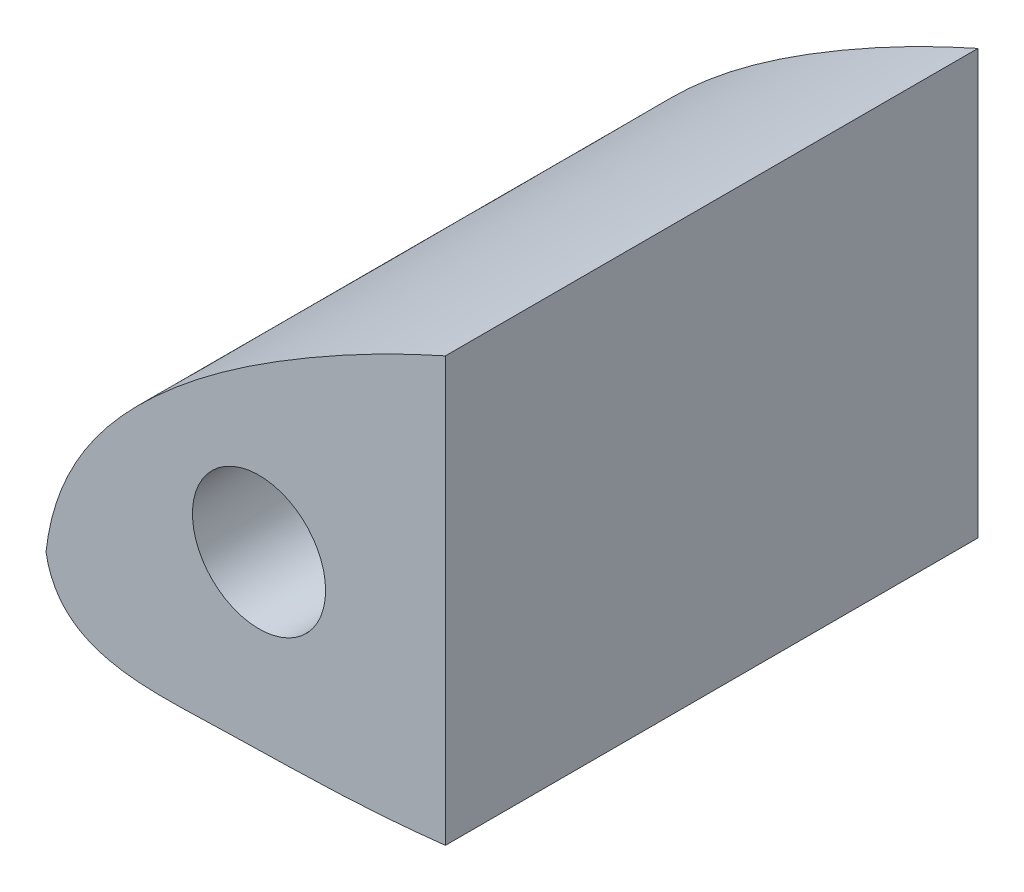
ISO-10303-21;
HEADER;
FILE_DESCRIPTION(('STEP AP214'),'2;1');
FILE_NAME('part.step','',(''),(''),'','','');
FILE_SCHEMA(('AUTOMOTIVE_DESIGN { 1 0 10303 214 1 1 1 1 }'));
ENDSEC;
DATA;
#1=APPLICATION_CONTEXT('core data for automotive mechanical design processes');
#2=APPLICATION_PROTOCOL_DEFINITION('international standard','automotive_design',2000,#1);
#3=PRODUCT_CONTEXT('',#1,'mechanical');
#4=PRODUCT('Part','Part','',(#3));
#5=PRODUCT_RELATED_PRODUCT_CATEGORY('part','',(#4));
#6=PRODUCT_DEFINITION_FORMATION('','',#4);
#7=PRODUCT_DEFINITION_CONTEXT('part definition',#1,'design');
#8=PRODUCT_DEFINITION('design','',#6,#7);
#9=PRODUCT_DEFINITION_SHAPE('','',#8);
#10=(LENGTH_UNIT() NAMED_UNIT(*) SI_UNIT(.MILLI.,.METRE.));
#11=(NAMED_UNIT(*) PLANE_ANGLE_UNIT() SI_UNIT($,.RADIAN.));
#12=(NAMED_UNIT(*) SI_UNIT($,.STERADIAN.) SOLID_ANGLE_UNIT());
#13=UNCERTAINTY_MEASURE_WITH_UNIT(LENGTH_MEASURE(1.E-05),#10,'distance_accuracy_value','');
#14=(GEOMETRIC_REPRESENTATION_CONTEXT(3) GLOBAL_UNCERTAINTY_ASSIGNED_CONTEXT((#13)) GLOBAL_UNIT_ASSIGNED_CONTEXT((#10,
#11,#12)) REPRESENTATION_CONTEXT('',''));
#15=CARTESIAN_POINT('',(0.,0.,0.));
#16=DIRECTION('',(0.,0.,1.));
#17=DIRECTION('',(1.,0.,0.));
#18=AXIS2_PLACEMENT_3D('',#15,#16,#17);
#19=CARTESIAN_POINT('',(0.000560351162113587,0.000130087070423624,50.8));
#20=CARTESIAN_POINT('',(1.23071418869678,-6.92407609127206,50.8));
#21=CARTESIAN_POINT('',(15.3166033306834,-6.18906584099094,50.8));
#22=CARTESIAN_POINT('',(36.4546728163185,-6.09849990105009,50.8));
#23=CARTESIAN_POINT('',(66.5061971849192,-0.586669106973501,50.8));
#24=CARTESIAN_POINT('',(110.497331171581,6.18149522271792,50.8));
#25=CARTESIAN_POINT('',(157.718638091679,9.03065014873911,50.8));
#26=CARTESIAN_POINT('',(205.10142463584,8.83808028186313,50.8));
#27=CARTESIAN_POINT('',(235.858814759408,7.87030619247826,50.8));
#28=CARTESIAN_POINT('',(260.846344817159,5.42741339404395,50.8));
#29=CARTESIAN_POINT('',(276.264022989737,4.51435670375389,50.8));
#30=CARTESIAN_POINT('',(293.989507544058,2.09398731346533,50.8));
#31=CARTESIAN_POINT('',(303.956832564589,1.47095520994628,50.8));
#32=CARTESIAN_POINT('',(309.846313894505,0.000130087070423666,50.8));
#33=B_SPLINE_CURVE_WITH_KNOTS('',3,(#19,#20,#21,#22,#23,#24,#25,#26,#27,#28,#29,#30,#31,#32),
.UNSPECIFIED.,.F.,.F.,(4,1,1,1,1,1,1,1,1,1,1,4),(0.,0.0569078595717698,0.106482711504673,
0.214488052979465,0.341297688349143,0.535095665520157,0.664680853556909,0.794660698192775,
0.828978881532905,0.904725108725214,0.942212919019968,1.),.UNSPECIFIED.);
#34=DIRECTION('',(0.,0.,-1.));
#35=VECTOR('',#34,1.);
#36=SURFACE_OF_LINEAR_EXTRUSION('',#33,#35);
#37=CARTESIAN_POINT('',(0.000560351162113587,0.000130087070423624,0.));
#38=CARTESIAN_POINT('',(1.23071418869678,-6.92407609127206,0.));
#39=CARTESIAN_POINT('',(15.3166033306834,-6.18906584099094,0.));
#40=CARTESIAN_POINT('',(36.4546728163185,-6.09849990105009,0.));
#41=CARTESIAN_POINT('',(66.5061971849192,-0.586669106973501,0.));
#42=CARTESIAN_POINT('',(110.497331171581,6.18149522271792,0.));
#43=CARTESIAN_POINT('',(157.718638091679,9.03065014873911,0.));
#44=CARTESIAN_POINT('',(205.10142463584,8.83808028186313,0.));
#45=CARTESIAN_POINT('',(235.858814759408,7.87030619247826,0.));
#46=CARTESIAN_POINT('',(260.846344817159,5.42741339404395,0.));
#47=CARTESIAN_POINT('',(276.264022989737,4.51435670375389,0.));
#48=CARTESIAN_POINT('',(293.989507544058,2.09398731346533,0.));
#49=CARTESIAN_POINT('',(303.956832564589,1.47095520994628,0.));
#50=CARTESIAN_POINT('',(309.846313894505,0.000130087070423666,0.));
#51=B_SPLINE_CURVE_WITH_KNOTS('',3,(#37,#38,#39,#40,#41,#42,#43,#44,#45,#46,#47,#48,#49,#50),
.UNSPECIFIED.,.F.,.F.,(4,1,1,1,1,1,1,1,1,1,1,4),(0.,0.0569078595717698,0.106482711504673,
0.214488052979465,0.341297688349143,0.535095665520157,0.664680853556909,0.794660698192775,
0.828978881532905,0.904725108725214,0.942212919019968,1.),.UNSPECIFIED.);
#52=CARTESIAN_POINT('',(0.000560351162116727,0.000130087070423829,0.));
#53=VERTEX_POINT('',#52);
#54=CARTESIAN_POINT('',(38.0999999979874,-5.18097252426853,0.));
#55=VERTEX_POINT('',#54);
#56=EDGE_CURVE('E94',#53,#55,#51,.T.);
#57=ORIENTED_EDGE('',*,*,#56,.T.);
#58=DIRECTION('',(0.,0.,-1.));
#59=VECTOR('',#58,1.);
#60=CARTESIAN_POINT('',(38.1,-5.18097252404465,50.8));
#61=LINE('',#60,#59);
#62=CARTESIAN_POINT('',(38.1,-5.18097252426854,50.8));
#63=VERTEX_POINT('',#62);
#64=EDGE_CURVE('E53',#55,#63,#61,.F.);
#65=ORIENTED_EDGE('',*,*,#64,.T.);
#66=CARTESIAN_POINT('',(0.000560351162116727,0.000130087070423829,50.8));
#67=VERTEX_POINT('',#66);
#68=EDGE_CURVE('E81',#67,#63,#33,.T.);
#69=ORIENTED_EDGE('',*,*,#68,.F.);
#70=DIRECTION('',(0.,0.,-1.));
#71=VECTOR('',#70,1.);
#72=CARTESIAN_POINT('',(0.000560351162116727,0.000130087070423829,50.8));
#73=LINE('',#72,#71);
#74=EDGE_CURVE('E11',#67,#53,#73,.T.);
#75=ORIENTED_EDGE('',*,*,#74,.T.);
#76=EDGE_LOOP('',(#57,#65,#69,#75));
#77=FACE_BOUND('',#76,.T.);
#78=ADVANCED_FACE('F38',(#77),#36,.F.);
#79=CARTESIAN_POINT('',(309.846313894505,0.000130087070423864,50.8));
#80=CARTESIAN_POINT('',(314.816918223261,-0.51620674157964,50.8));
#81=CARTESIAN_POINT('',(301.273197720551,4.38282813873556,50.8));
#82=CARTESIAN_POINT('',(290.359837670022,8.71099439045776,50.8));
#83=CARTESIAN_POINT('',(256.952064400645,19.5289209482833,50.8));
#84=CARTESIAN_POINT('',(217.961060472083,29.6129748944238,50.8));
#85=CARTESIAN_POINT('',(173.256699242147,40.0411042779434,50.8));
#86=CARTESIAN_POINT('',(131.400792108858,47.8848319151037,50.8));
#87=CARTESIAN_POINT('',(89.5976184754884,49.290763053775,50.8));
#88=CARTESIAN_POINT('',(52.1111282710831,42.0692152748914,50.8));
#89=CARTESIAN_POINT('',(26.2867198183782,29.9751763284633,50.8));
#90=CARTESIAN_POINT('',(8.64909202481883,17.8566051741579,50.8));
#91=CARTESIAN_POINT('',(0.810633126632263,7.35919605469637,50.8));
#92=CARTESIAN_POINT('',(0.000560351162116727,0.000130087070423829,50.8));
#93=B_SPLINE_CURVE_WITH_KNOTS('',3,(#79,#80,#81,#82,#83,#84,#85,#86,#87,#88,#89,#90,#91,#92),
.UNSPECIFIED.,.F.,.F.,(4,1,1,1,1,1,1,1,1,1,1,4),(0.,0.0239417713693992,0.070244030177139,
0.147561721425381,0.308455887006792,0.442387865106874,0.551517565626309,0.687091076796298,
0.811391258419108,0.886311735305172,0.939136382225768,1.),.UNSPECIFIED.);
#94=DIRECTION('',(0.,0.,-1.));
#95=VECTOR('',#94,1.);
#96=SURFACE_OF_LINEAR_EXTRUSION('',#93,#95);
#97=CARTESIAN_POINT('',(38.1,35.2581330206231,50.8));
#98=VERTEX_POINT('',#97);
#99=EDGE_CURVE('E46',#98,#67,#93,.T.);
#100=ORIENTED_EDGE('',*,*,#99,.F.);
#101=DIRECTION('',(0.,0.,-1.));
#102=VECTOR('',#101,1.);
#103=CARTESIAN_POINT('',(38.1,35.2581330224171,50.8));
#104=LINE('',#103,#102);
#105=CARTESIAN_POINT('',(38.1,35.2581330206231,0.));
#106=VERTEX_POINT('',#105);
#107=EDGE_CURVE('E72',#98,#106,#104,.T.);
#108=ORIENTED_EDGE('',*,*,#107,.T.);
#109=CARTESIAN_POINT('',(309.846313894505,0.000130087070423864,0.));
#110=CARTESIAN_POINT('',(314.816918223261,-0.51620674157964,0.));
#111=CARTESIAN_POINT('',(301.273197720551,4.38282813873556,0.));
#112=CARTESIAN_POINT('',(290.359837670022,8.71099439045776,0.));
#113=CARTESIAN_POINT('',(256.952064400645,19.5289209482833,0.));
#114=CARTESIAN_POINT('',(217.961060472083,29.6129748944238,0.));
#115=CARTESIAN_POINT('',(173.256699242147,40.0411042779434,0.));
#116=CARTESIAN_POINT('',(131.400792108858,47.8848319151037,0.));
#117=CARTESIAN_POINT('',(89.5976184754884,49.290763053775,0.));
#118=CARTESIAN_POINT('',(52.1111282710831,42.0692152748914,0.));
#119=CARTESIAN_POINT('',(26.2867198183782,29.9751763284633,0.));
#120=CARTESIAN_POINT('',(8.64909202481883,17.8566051741579,0.));
#121=CARTESIAN_POINT('',(0.810633126632263,7.35919605469637,0.));
#122=CARTESIAN_POINT('',(0.000560351162116727,0.000130087070423829,0.));
#123=B_SPLINE_CURVE_WITH_KNOTS('',3,(#109,#110,#111,#112,#113,#114,#115,#116,#117,#118,#119,
#120,#121,#122),.UNSPECIFIED.,.F.,.F.,(4,1,1,1,1,1,1,1,1,1,1,4),(0.,0.0239417713693992,
0.070244030177139,0.147561721425381,0.308455887006792,0.442387865106874,0.551517565626309,
0.687091076796298,0.811391258419108,0.886311735305172,0.939136382225768,1.),.UNSPECIFIED.);
#124=EDGE_CURVE('E85',#106,#53,#123,.T.);
#125=ORIENTED_EDGE('',*,*,#124,.T.);
#126=ORIENTED_EDGE('',*,*,#74,.F.);
#127=EDGE_LOOP('',(#100,#108,#125,#126));
#128=FACE_BOUND('',#127,.T.);
#129=ADVANCED_FACE('F83',(#128),#96,.F.);
#130=CARTESIAN_POINT('',(153.387816973495,8.33338198857885,50.8));
#131=DIRECTION('',(0.,0.,-1.));
#132=DIRECTION('',(-1.,0.,0.));
#133=AXIS2_PLACEMENT_3D('',#130,#131,#132);
#134=PLANE('',#133);
#135=CARTESIAN_POINT('',(20.32,10.16,50.8));
#136=DIRECTION('',(0.,0.,1.));
#137=DIRECTION('',(1.,0.,0.));
#138=AXIS2_PLACEMENT_3D('',#135,#136,#137);
#139=CIRCLE('',#138,6.35);
#140=CARTESIAN_POINT('',(26.67,10.16,50.8));
#141=VERTEX_POINT('',#140);
#142=EDGE_CURVE('E124',#141,#141,#139,.T.);
#143=ORIENTED_EDGE('',*,*,#142,.F.);
#144=EDGE_LOOP('',(#143));
#145=FACE_BOUND('',#144,.T.);
#146=ORIENTED_EDGE('',*,*,#68,.T.);
#147=DIRECTION('',(0.,-1.,0.));
#148=VECTOR('',#147,1.);
#149=CARTESIAN_POINT('',(38.1,71.7179988353335,50.8));
#150=LINE('',#149,#148);
#151=EDGE_CURVE('E74',#98,#63,#150,.T.);
#152=ORIENTED_EDGE('',*,*,#151,.F.);
#153=ORIENTED_EDGE('',*,*,#99,.T.);
#154=EDGE_LOOP('',(#146,#152,#153));
#155=FACE_BOUND('',#154,.T.);
#156=ADVANCED_FACE('F79',(#145,#155),#134,.F.);
#157=CARTESIAN_POINT('',(153.387816973495,8.33338198857885,0.));
#158=DIRECTION('',(0.,0.,-1.));
#159=DIRECTION('',(-1.,0.,0.));
#160=AXIS2_PLACEMENT_3D('',#157,#158,#159);
#161=PLANE('',#160);
#162=DIRECTION('',(0.,-1.,0.));
#163=VECTOR('',#162,1.);
#164=CARTESIAN_POINT('',(38.1,71.7179988353335,0.));
#165=LINE('',#164,#163);
#166=EDGE_CURVE('E75',#106,#55,#165,.T.);
#167=ORIENTED_EDGE('',*,*,#166,.T.);
#168=ORIENTED_EDGE('',*,*,#56,.F.);
#169=ORIENTED_EDGE('',*,*,#124,.F.);
#170=EDGE_LOOP('',(#167,#168,#169));
#171=FACE_BOUND('',#170,.T.);
#172=CARTESIAN_POINT('',(20.32,10.16,0.));
#173=DIRECTION('',(0.,0.,1.));
#174=DIRECTION('',(1.,0.,0.));
#175=AXIS2_PLACEMENT_3D('',#172,#173,#174);
#176=CIRCLE('',#175,6.35);
#177=CARTESIAN_POINT('',(26.67,10.16,0.));
#178=VERTEX_POINT('',#177);
#179=EDGE_CURVE('E122',#178,#178,#176,.T.);
#180=ORIENTED_EDGE('',*,*,#179,.T.);
#181=EDGE_LOOP('',(#180));
#182=FACE_BOUND('',#181,.T.);
#183=ADVANCED_FACE('F102',(#171,#182),#161,.T.);
#184=CARTESIAN_POINT('',(20.32,10.16,0.));
#185=DIRECTION('',(0.,0.,1.));
#186=DIRECTION('',(1.,0.,0.));
#187=AXIS2_PLACEMENT_3D('',#184,#185,#186);
#188=CYLINDRICAL_SURFACE('',#187,6.35);
#189=ORIENTED_EDGE('',*,*,#179,.F.);
#190=EDGE_LOOP('',(#189));
#191=FACE_BOUND('',#190,.T.);
#192=ORIENTED_EDGE('',*,*,#142,.T.);
#193=EDGE_LOOP('',(#192));
#194=FACE_BOUND('',#193,.T.);
#195=ADVANCED_FACE('F105',(#191,#194),#188,.F.);
#196=CARTESIAN_POINT('',(38.1,71.7179988353335,0.));
#197=DIRECTION('',(-1.,0.,0.));
#198=DIRECTION('',(0.,-1.,0.));
#199=AXIS2_PLACEMENT_3D('',#196,#197,#198);
#200=PLANE('',#199);
#201=ORIENTED_EDGE('',*,*,#166,.F.);
#202=ORIENTED_EDGE('',*,*,#107,.F.);
#203=ORIENTED_EDGE('',*,*,#151,.T.);
#204=ORIENTED_EDGE('',*,*,#64,.F.);
#205=EDGE_LOOP('',(#201,#202,#203,#204));
#206=FACE_BOUND('',#205,.T.);
#207=ADVANCED_FACE('F73',(#206),#200,.F.);
#208=CLOSED_SHELL('',(#78,#129,#156,#183,#195,#207));
#209=MANIFOLD_SOLID_BREP('B2',#208);
#210=ADVANCED_BREP_SHAPE_REPRESENTATION('',(#18,#209),#14);
#211=SHAPE_DEFINITION_REPRESENTATION(#9,#210);
ENDSEC;
END-ISO-10303-21;
